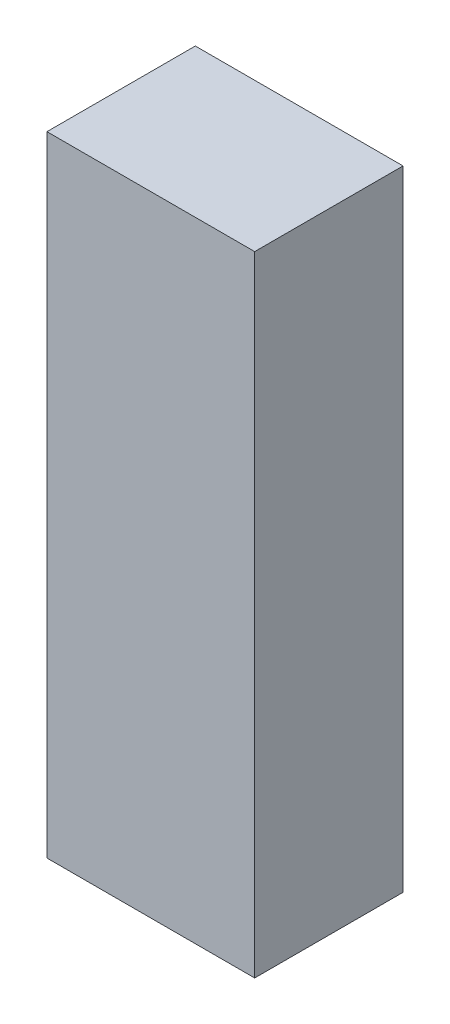
ISO-10303-21;
HEADER;
FILE_DESCRIPTION(('STEP AP214'),'2;1');
FILE_NAME('part.step','',(''),(''),'','','');
FILE_SCHEMA(('AUTOMOTIVE_DESIGN { 1 0 10303 214 1 1 1 1 }'));
ENDSEC;
DATA;
#1=APPLICATION_CONTEXT('core data for automotive mechanical design processes');
#2=APPLICATION_PROTOCOL_DEFINITION('international standard','automotive_design',2000,#1);
#3=PRODUCT_CONTEXT('',#1,'mechanical');
#4=PRODUCT('Part','Part','',(#3));
#5=PRODUCT_RELATED_PRODUCT_CATEGORY('part','',(#4));
#6=PRODUCT_DEFINITION_FORMATION('','',#4);
#7=PRODUCT_DEFINITION_CONTEXT('part definition',#1,'design');
#8=PRODUCT_DEFINITION('design','',#6,#7);
#9=PRODUCT_DEFINITION_SHAPE('','',#8);
#10=(LENGTH_UNIT() NAMED_UNIT(*) SI_UNIT(.MILLI.,.METRE.));
#11=(NAMED_UNIT(*) PLANE_ANGLE_UNIT() SI_UNIT($,.RADIAN.));
#12=(NAMED_UNIT(*) SI_UNIT($,.STERADIAN.) SOLID_ANGLE_UNIT());
#13=UNCERTAINTY_MEASURE_WITH_UNIT(LENGTH_MEASURE(1.E-05),#10,'distance_accuracy_value','');
#14=(GEOMETRIC_REPRESENTATION_CONTEXT(3) GLOBAL_UNCERTAINTY_ASSIGNED_CONTEXT((#13)) GLOBAL_UNIT_ASSIGNED_CONTEXT((#10,
#11,#12)) REPRESENTATION_CONTEXT('',''));
#15=CARTESIAN_POINT('',(0.,0.,0.));
#16=DIRECTION('',(0.,0.,1.));
#17=DIRECTION('',(1.,0.,0.));
#18=AXIS2_PLACEMENT_3D('',#15,#16,#17);
#19=CARTESIAN_POINT('',(17.5,-53.,25.));
#20=DIRECTION('',(0.,1.,0.));
#21=DIRECTION('',(0.,0.,1.));
#22=AXIS2_PLACEMENT_3D('',#19,#20,#21);
#23=PLANE('',#22);
#24=DIRECTION('',(1.,0.,0.));
#25=VECTOR('',#24,1.);
#26=CARTESIAN_POINT('',(17.5,-53.,0.));
#27=LINE('',#26,#25);
#28=CARTESIAN_POINT('',(-17.5,-53.,0.));
#29=VERTEX_POINT('',#28);
#30=CARTESIAN_POINT('',(17.5,-53.,0.));
#31=VERTEX_POINT('',#30);
#32=EDGE_CURVE('E105',#29,#31,#27,.T.);
#33=ORIENTED_EDGE('',*,*,#32,.T.);
#34=DIRECTION('',(0.,0.,-1.));
#35=VECTOR('',#34,1.);
#36=CARTESIAN_POINT('',(17.5,-53.,25.));
#37=LINE('',#36,#35);
#38=CARTESIAN_POINT('',(17.5,-53.,25.));
#39=VERTEX_POINT('',#38);
#40=EDGE_CURVE('E11',#39,#31,#37,.T.);
#41=ORIENTED_EDGE('',*,*,#40,.F.);
#42=DIRECTION('',(1.,0.,0.));
#43=VECTOR('',#42,1.);
#44=CARTESIAN_POINT('',(17.5,-53.,25.));
#45=LINE('',#44,#43);
#46=CARTESIAN_POINT('',(-17.5,-53.,25.));
#47=VERTEX_POINT('',#46);
#48=EDGE_CURVE('E89',#47,#39,#45,.T.);
#49=ORIENTED_EDGE('',*,*,#48,.F.);
#50=DIRECTION('',(0.,0.,-1.));
#51=VECTOR('',#50,1.);
#52=CARTESIAN_POINT('',(-17.5,-53.,25.));
#53=LINE('',#52,#51);
#54=EDGE_CURVE('E97',#47,#29,#53,.T.);
#55=ORIENTED_EDGE('',*,*,#54,.T.);
#56=EDGE_LOOP('',(#33,#41,#49,#55));
#57=FACE_BOUND('',#56,.T.);
#58=ADVANCED_FACE('F39',(#57),#23,.F.);
#59=CARTESIAN_POINT('',(17.5,-53.,25.));
#60=DIRECTION('',(-1.,0.,0.));
#61=DIRECTION('',(0.,0.,1.));
#62=AXIS2_PLACEMENT_3D('',#59,#60,#61);
#63=PLANE('',#62);
#64=DIRECTION('',(0.,1.,0.));
#65=VECTOR('',#64,1.);
#66=CARTESIAN_POINT('',(17.5,-53.,0.));
#67=LINE('',#66,#65);
#68=CARTESIAN_POINT('',(17.5,53.,0.));
#69=VERTEX_POINT('',#68);
#70=EDGE_CURVE('E92',#31,#69,#67,.T.);
#71=ORIENTED_EDGE('',*,*,#70,.T.);
#72=DIRECTION('',(0.,0.,-1.));
#73=VECTOR('',#72,1.);
#74=CARTESIAN_POINT('',(17.5,53.,25.));
#75=LINE('',#74,#73);
#76=CARTESIAN_POINT('',(17.5,53.,25.));
#77=VERTEX_POINT('',#76);
#78=EDGE_CURVE('E50',#77,#69,#75,.T.);
#79=ORIENTED_EDGE('',*,*,#78,.F.);
#80=DIRECTION('',(0.,1.,0.));
#81=VECTOR('',#80,1.);
#82=CARTESIAN_POINT('',(17.5,-53.,25.));
#83=LINE('',#82,#81);
#84=EDGE_CURVE('E82',#39,#77,#83,.T.);
#85=ORIENTED_EDGE('',*,*,#84,.F.);
#86=ORIENTED_EDGE('',*,*,#40,.T.);
#87=EDGE_LOOP('',(#71,#79,#85,#86));
#88=FACE_BOUND('',#87,.T.);
#89=ADVANCED_FACE('F93',(#88),#63,.F.);
#90=CARTESIAN_POINT('',(17.5,53.,25.));
#91=DIRECTION('',(0.,-1.,0.));
#92=DIRECTION('',(0.,0.,-1.));
#93=AXIS2_PLACEMENT_3D('',#90,#91,#92);
#94=PLANE('',#93);
#95=DIRECTION('',(-1.,0.,0.));
#96=VECTOR('',#95,1.);
#97=CARTESIAN_POINT('',(17.5,53.,0.));
#98=LINE('',#97,#96);
#99=CARTESIAN_POINT('',(-17.5,53.,0.));
#100=VERTEX_POINT('',#99);
#101=EDGE_CURVE('E72',#69,#100,#98,.T.);
#102=ORIENTED_EDGE('',*,*,#101,.T.);
#103=DIRECTION('',(0.,0.,-1.));
#104=VECTOR('',#103,1.);
#105=CARTESIAN_POINT('',(-17.5,53.,25.));
#106=LINE('',#105,#104);
#107=CARTESIAN_POINT('',(-17.5,53.,25.));
#108=VERTEX_POINT('',#107);
#109=EDGE_CURVE('E94',#108,#100,#106,.T.);
#110=ORIENTED_EDGE('',*,*,#109,.F.);
#111=DIRECTION('',(-1.,0.,0.));
#112=VECTOR('',#111,1.);
#113=CARTESIAN_POINT('',(17.5,53.,25.));
#114=LINE('',#113,#112);
#115=EDGE_CURVE('E88',#77,#108,#114,.T.);
#116=ORIENTED_EDGE('',*,*,#115,.F.);
#117=ORIENTED_EDGE('',*,*,#78,.T.);
#118=EDGE_LOOP('',(#102,#110,#116,#117));
#119=FACE_BOUND('',#118,.T.);
#120=ADVANCED_FACE('F96',(#119),#94,.F.);
#121=CARTESIAN_POINT('',(-17.5,-53.,25.));
#122=DIRECTION('',(1.,0.,0.));
#123=DIRECTION('',(0.,0.,-1.));
#124=AXIS2_PLACEMENT_3D('',#121,#122,#123);
#125=PLANE('',#124);
#126=DIRECTION('',(0.,-1.,0.));
#127=VECTOR('',#126,1.);
#128=CARTESIAN_POINT('',(-17.5,-53.,0.));
#129=LINE('',#128,#127);
#130=EDGE_CURVE('E76',#100,#29,#129,.T.);
#131=ORIENTED_EDGE('',*,*,#130,.T.);
#132=ORIENTED_EDGE('',*,*,#54,.F.);
#133=DIRECTION('',(0.,-1.,0.));
#134=VECTOR('',#133,1.);
#135=CARTESIAN_POINT('',(-17.5,-53.,25.));
#136=LINE('',#135,#134);
#137=EDGE_CURVE('E54',#108,#47,#136,.T.);
#138=ORIENTED_EDGE('',*,*,#137,.F.);
#139=ORIENTED_EDGE('',*,*,#109,.T.);
#140=EDGE_LOOP('',(#131,#132,#138,#139));
#141=FACE_BOUND('',#140,.T.);
#142=ADVANCED_FACE('F108',(#141),#125,.F.);
#143=CARTESIAN_POINT('',(0.,0.,25.));
#144=DIRECTION('',(0.,0.,-1.));
#145=DIRECTION('',(-1.,0.,0.));
#146=AXIS2_PLACEMENT_3D('',#143,#144,#145);
#147=PLANE('',#146);
#148=ORIENTED_EDGE('',*,*,#48,.T.);
#149=ORIENTED_EDGE('',*,*,#84,.T.);
#150=ORIENTED_EDGE('',*,*,#115,.T.);
#151=ORIENTED_EDGE('',*,*,#137,.T.);
#152=EDGE_LOOP('',(#148,#149,#150,#151));
#153=FACE_BOUND('',#152,.T.);
#154=ADVANCED_FACE('F86',(#153),#147,.F.);
#155=CARTESIAN_POINT('',(0.,0.,0.));
#156=DIRECTION('',(0.,0.,-1.));
#157=DIRECTION('',(-1.,0.,0.));
#158=AXIS2_PLACEMENT_3D('',#155,#156,#157);
#159=PLANE('',#158);
#160=ORIENTED_EDGE('',*,*,#32,.F.);
#161=ORIENTED_EDGE('',*,*,#130,.F.);
#162=ORIENTED_EDGE('',*,*,#101,.F.);
#163=ORIENTED_EDGE('',*,*,#70,.F.);
#164=EDGE_LOOP('',(#160,#161,#162,#163));
#165=FACE_BOUND('',#164,.T.);
#166=ADVANCED_FACE('F115',(#165),#159,.T.);
#167=CLOSED_SHELL('',(#58,#89,#120,#142,#154,#166));
#168=MANIFOLD_SOLID_BREP('B2',#167);
#169=ADVANCED_BREP_SHAPE_REPRESENTATION('',(#18,#168),#14);
#170=SHAPE_DEFINITION_REPRESENTATION(#9,#169);
ENDSEC;
END-ISO-10303-21;
